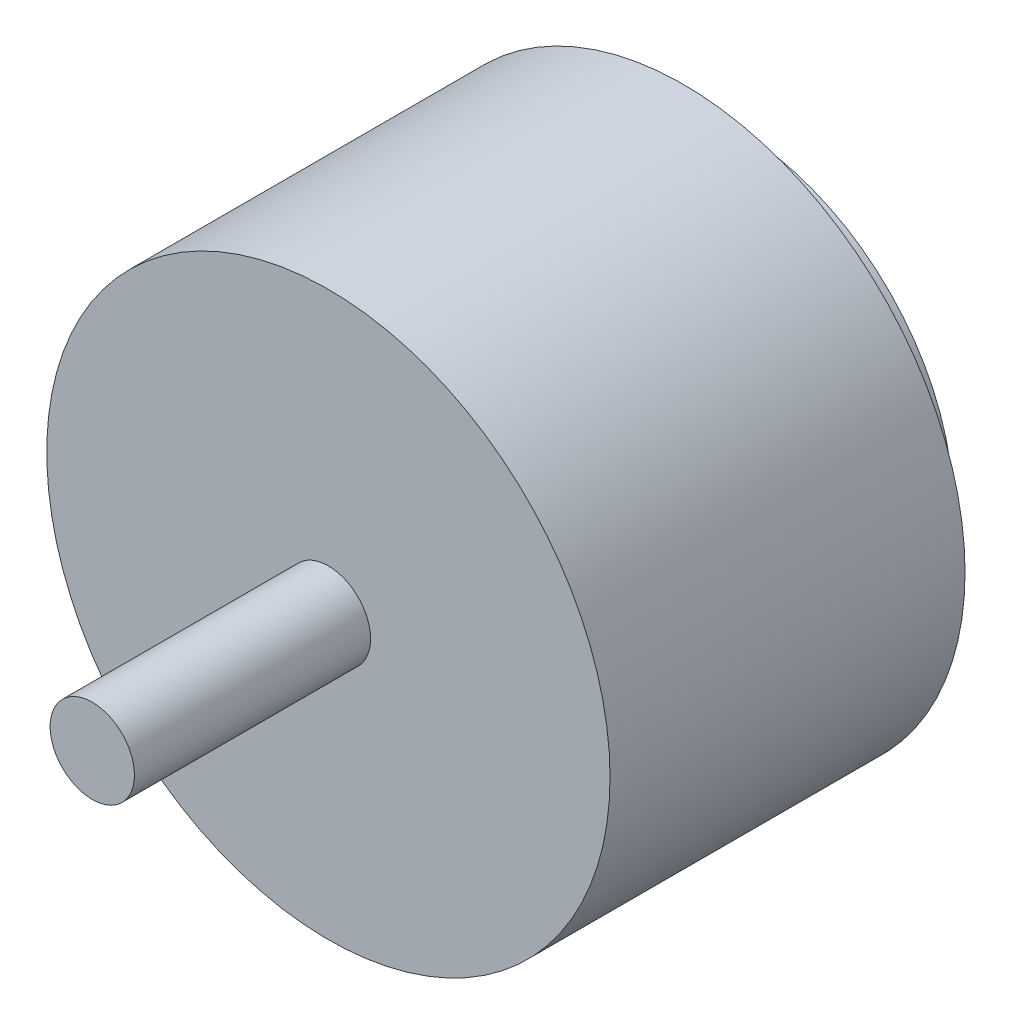
ISO-10303-21;
HEADER;
FILE_DESCRIPTION(('STEP AP214'),'2;1');
FILE_NAME('part.step','',(''),(''),'','','');
FILE_SCHEMA(('AUTOMOTIVE_DESIGN { 1 0 10303 214 1 1 1 1 }'));
ENDSEC;
DATA;
#1=APPLICATION_CONTEXT('core data for automotive mechanical design processes');
#2=APPLICATION_PROTOCOL_DEFINITION('international standard','automotive_design',2000,#1);
#3=PRODUCT_CONTEXT('',#1,'mechanical');
#4=PRODUCT('Part','Part','',(#3));
#5=PRODUCT_RELATED_PRODUCT_CATEGORY('part','',(#4));
#6=PRODUCT_DEFINITION_FORMATION('','',#4);
#7=PRODUCT_DEFINITION_CONTEXT('part definition',#1,'design');
#8=PRODUCT_DEFINITION('design','',#6,#7);
#9=PRODUCT_DEFINITION_SHAPE('','',#8);
#10=(LENGTH_UNIT() NAMED_UNIT(*) SI_UNIT(.MILLI.,.METRE.));
#11=(NAMED_UNIT(*) PLANE_ANGLE_UNIT() SI_UNIT($,.RADIAN.));
#12=(NAMED_UNIT(*) SI_UNIT($,.STERADIAN.) SOLID_ANGLE_UNIT());
#13=UNCERTAINTY_MEASURE_WITH_UNIT(LENGTH_MEASURE(1.E-05),#10,'distance_accuracy_value','');
#14=(GEOMETRIC_REPRESENTATION_CONTEXT(3) GLOBAL_UNCERTAINTY_ASSIGNED_CONTEXT((#13)) GLOBAL_UNIT_ASSIGNED_CONTEXT((#10,
#11,#12)) REPRESENTATION_CONTEXT('',''));
#15=CARTESIAN_POINT('',(0.,0.,0.));
#16=DIRECTION('',(0.,0.,1.));
#17=DIRECTION('',(1.,0.,0.));
#18=AXIS2_PLACEMENT_3D('',#15,#16,#17);
#19=CARTESIAN_POINT('',(0.,0.,0.));
#20=DIRECTION('',(0.,0.,1.));
#21=DIRECTION('',(1.,0.,0.));
#22=AXIS2_PLACEMENT_3D('',#19,#20,#21);
#23=PLANE('',#22);
#24=CARTESIAN_POINT('',(0.,0.,0.));
#25=DIRECTION('',(0.,0.,1.));
#26=DIRECTION('',(1.,0.,0.));
#27=AXIS2_PLACEMENT_3D('',#24,#25,#26);
#28=CIRCLE('',#27,13.);
#29=CARTESIAN_POINT('',(13.,0.,0.));
#30=VERTEX_POINT('',#29);
#31=EDGE_CURVE('E41',#30,#30,#28,.T.);
#32=ORIENTED_EDGE('',*,*,#31,.F.);
#33=EDGE_LOOP('',(#32));
#34=FACE_BOUND('',#33,.T.);
#35=CARTESIAN_POINT('',(-9.5,0.,0.));
#36=DIRECTION('',(0.,0.,1.));
#37=DIRECTION('',(1.,0.,0.));
#38=AXIS2_PLACEMENT_3D('',#35,#36,#37);
#39=CIRCLE('',#38,1.6);
#40=CARTESIAN_POINT('',(-7.9,0.,0.));
#41=VERTEX_POINT('',#40);
#42=EDGE_CURVE('E78',#41,#41,#39,.T.);
#43=ORIENTED_EDGE('',*,*,#42,.T.);
#44=EDGE_LOOP('',(#43));
#45=FACE_BOUND('',#44,.T.);
#46=CARTESIAN_POINT('',(0.,-9.5,0.));
#47=DIRECTION('',(0.,0.,1.));
#48=DIRECTION('',(1.,0.,0.));
#49=AXIS2_PLACEMENT_3D('',#46,#47,#48);
#50=CIRCLE('',#49,1.6);
#51=CARTESIAN_POINT('',(1.6,-9.5,0.));
#52=VERTEX_POINT('',#51);
#53=EDGE_CURVE('E73',#52,#52,#50,.T.);
#54=ORIENTED_EDGE('',*,*,#53,.T.);
#55=EDGE_LOOP('',(#54));
#56=FACE_BOUND('',#55,.T.);
#57=CARTESIAN_POINT('',(9.5,0.,0.));
#58=DIRECTION('',(0.,0.,1.));
#59=DIRECTION('',(1.,0.,0.));
#60=AXIS2_PLACEMENT_3D('',#57,#58,#59);
#61=CIRCLE('',#60,1.6);
#62=CARTESIAN_POINT('',(11.1,0.,0.));
#63=VERTEX_POINT('',#62);
#64=EDGE_CURVE('E66',#63,#63,#61,.T.);
#65=ORIENTED_EDGE('',*,*,#64,.T.);
#66=EDGE_LOOP('',(#65));
#67=FACE_BOUND('',#66,.T.);
#68=CARTESIAN_POINT('',(0.,9.5,0.));
#69=DIRECTION('',(0.,0.,1.));
#70=DIRECTION('',(1.,0.,0.));
#71=AXIS2_PLACEMENT_3D('',#68,#69,#70);
#72=CIRCLE('',#71,1.6);
#73=CARTESIAN_POINT('',(1.6,9.5,0.));
#74=VERTEX_POINT('',#73);
#75=EDGE_CURVE('E63',#74,#74,#72,.T.);
#76=ORIENTED_EDGE('',*,*,#75,.T.);
#77=EDGE_LOOP('',(#76));
#78=FACE_BOUND('',#77,.T.);
#79=ADVANCED_FACE('F37',(#34,#45,#56,#67,#78),#23,.F.);
#80=CARTESIAN_POINT('',(0.,0.,3.));
#81=DIRECTION('',(0.,0.,-1.));
#82=DIRECTION('',(-1.,0.,0.));
#83=AXIS2_PLACEMENT_3D('',#80,#81,#82);
#84=CYLINDRICAL_SURFACE('',#83,13.);
#85=CARTESIAN_POINT('',(0.,0.,3.));
#86=DIRECTION('',(0.,0.,1.));
#87=DIRECTION('',(1.,0.,0.));
#88=AXIS2_PLACEMENT_3D('',#85,#86,#87);
#89=CIRCLE('',#88,13.);
#90=CARTESIAN_POINT('',(13.,0.,3.));
#91=VERTEX_POINT('',#90);
#92=EDGE_CURVE('E45',#91,#91,#89,.T.);
#93=ORIENTED_EDGE('',*,*,#92,.F.);
#94=EDGE_LOOP('',(#93));
#95=FACE_BOUND('',#94,.T.);
#96=ORIENTED_EDGE('',*,*,#31,.T.);
#97=EDGE_LOOP('',(#96));
#98=FACE_BOUND('',#97,.T.);
#99=ADVANCED_FACE('F39',(#95,#98),#84,.T.);
#100=CARTESIAN_POINT('',(-9.5,0.,3.));
#101=DIRECTION('',(0.,0.,-1.));
#102=DIRECTION('',(-1.,0.,0.));
#103=AXIS2_PLACEMENT_3D('',#100,#101,#102);
#104=CYLINDRICAL_SURFACE('',#103,1.6);
#105=CARTESIAN_POINT('',(-9.5,0.,3.));
#106=DIRECTION('',(0.,0.,1.));
#107=DIRECTION('',(1.,0.,0.));
#108=AXIS2_PLACEMENT_3D('',#105,#106,#107);
#109=CIRCLE('',#108,1.6);
#110=CARTESIAN_POINT('',(-7.9,0.,3.));
#111=VERTEX_POINT('',#110);
#112=EDGE_CURVE('E70',#111,#111,#109,.T.);
#113=ORIENTED_EDGE('',*,*,#112,.T.);
#114=EDGE_LOOP('',(#113));
#115=FACE_BOUND('',#114,.T.);
#116=ORIENTED_EDGE('',*,*,#42,.F.);
#117=EDGE_LOOP('',(#116));
#118=FACE_BOUND('',#117,.T.);
#119=ADVANCED_FACE('F118',(#115,#118),#104,.F.);
#120=CARTESIAN_POINT('',(0.,-9.5,3.));
#121=DIRECTION('',(0.,0.,-1.));
#122=DIRECTION('',(-1.,0.,0.));
#123=AXIS2_PLACEMENT_3D('',#120,#121,#122);
#124=CYLINDRICAL_SURFACE('',#123,1.6);
#125=CARTESIAN_POINT('',(0.,-9.5,3.));
#126=DIRECTION('',(0.,0.,1.));
#127=DIRECTION('',(1.,0.,0.));
#128=AXIS2_PLACEMENT_3D('',#125,#126,#127);
#129=CIRCLE('',#128,1.6);
#130=CARTESIAN_POINT('',(1.6,-9.5,3.));
#131=VERTEX_POINT('',#130);
#132=EDGE_CURVE('E62',#131,#131,#129,.T.);
#133=ORIENTED_EDGE('',*,*,#132,.T.);
#134=EDGE_LOOP('',(#133));
#135=FACE_BOUND('',#134,.T.);
#136=ORIENTED_EDGE('',*,*,#53,.F.);
#137=EDGE_LOOP('',(#136));
#138=FACE_BOUND('',#137,.T.);
#139=ADVANCED_FACE('F110',(#135,#138),#124,.F.);
#140=CARTESIAN_POINT('',(9.5,0.,3.));
#141=DIRECTION('',(0.,0.,-1.));
#142=DIRECTION('',(-1.,0.,0.));
#143=AXIS2_PLACEMENT_3D('',#140,#141,#142);
#144=CYLINDRICAL_SURFACE('',#143,1.6);
#145=CARTESIAN_POINT('',(9.5,0.,3.));
#146=DIRECTION('',(0.,0.,1.));
#147=DIRECTION('',(1.,0.,0.));
#148=AXIS2_PLACEMENT_3D('',#145,#146,#147);
#149=CIRCLE('',#148,1.6);
#150=CARTESIAN_POINT('',(11.1,0.,3.));
#151=VERTEX_POINT('',#150);
#152=EDGE_CURVE('E67',#151,#151,#149,.T.);
#153=ORIENTED_EDGE('',*,*,#152,.T.);
#154=EDGE_LOOP('',(#153));
#155=FACE_BOUND('',#154,.T.);
#156=ORIENTED_EDGE('',*,*,#64,.F.);
#157=EDGE_LOOP('',(#156));
#158=FACE_BOUND('',#157,.T.);
#159=ADVANCED_FACE('F99',(#155,#158),#144,.F.);
#160=CARTESIAN_POINT('',(0.,9.5,3.));
#161=DIRECTION('',(0.,0.,-1.));
#162=DIRECTION('',(-1.,0.,0.));
#163=AXIS2_PLACEMENT_3D('',#160,#161,#162);
#164=CYLINDRICAL_SURFACE('',#163,1.6);
#165=CARTESIAN_POINT('',(0.,9.5,3.));
#166=DIRECTION('',(0.,0.,1.));
#167=DIRECTION('',(1.,0.,0.));
#168=AXIS2_PLACEMENT_3D('',#165,#166,#167);
#169=CIRCLE('',#168,1.6);
#170=CARTESIAN_POINT('',(1.6,9.5,3.));
#171=VERTEX_POINT('',#170);
#172=EDGE_CURVE('E56',#171,#171,#169,.T.);
#173=ORIENTED_EDGE('',*,*,#172,.T.);
#174=EDGE_LOOP('',(#173));
#175=FACE_BOUND('',#174,.T.);
#176=ORIENTED_EDGE('',*,*,#75,.F.);
#177=EDGE_LOOP('',(#176));
#178=FACE_BOUND('',#177,.T.);
#179=ADVANCED_FACE('F96',(#175,#178),#164,.F.);
#180=CARTESIAN_POINT('',(0.,0.,3.));
#181=DIRECTION('',(0.,0.,1.));
#182=DIRECTION('',(1.,0.,0.));
#183=AXIS2_PLACEMENT_3D('',#180,#181,#182);
#184=PLANE('',#183);
#185=ORIENTED_EDGE('',*,*,#172,.F.);
#186=EDGE_LOOP('',(#185));
#187=FACE_BOUND('',#186,.T.);
#188=ADVANCED_FACE('F98',(#187),#184,.F.);
#189=ORIENTED_EDGE('',*,*,#132,.F.);
#190=EDGE_LOOP('',(#189));
#191=FACE_BOUND('',#190,.T.);
#192=ADVANCED_FACE('F106',(#191),#184,.F.);
#193=ORIENTED_EDGE('',*,*,#92,.T.);
#194=EDGE_LOOP('',(#193));
#195=FACE_BOUND('',#194,.T.);
#196=CARTESIAN_POINT('',(0.,0.,3.));
#197=DIRECTION('',(0.,0.,1.));
#198=DIRECTION('',(1.,0.,0.));
#199=AXIS2_PLACEMENT_3D('',#196,#197,#198);
#200=CIRCLE('',#199,16.7);
#201=CARTESIAN_POINT('',(16.7,0.,3.));
#202=VERTEX_POINT('',#201);
#203=EDGE_CURVE('E57',#202,#202,#200,.T.);
#204=ORIENTED_EDGE('',*,*,#203,.F.);
#205=EDGE_LOOP('',(#204));
#206=FACE_BOUND('',#205,.T.);
#207=ADVANCED_FACE('F109',(#195,#206),#184,.F.);
#208=CARTESIAN_POINT('',(0.,0.,24.05));
#209=DIRECTION('',(0.,0.,1.));
#210=DIRECTION('',(1.,0.,0.));
#211=AXIS2_PLACEMENT_3D('',#208,#209,#210);
#212=PLANE('',#211);
#213=CARTESIAN_POINT('',(0.,0.,24.05));
#214=DIRECTION('',(0.,0.,1.));
#215=DIRECTION('',(1.,0.,0.));
#216=AXIS2_PLACEMENT_3D('',#213,#214,#215);
#217=CIRCLE('',#216,2.5);
#218=CARTESIAN_POINT('',(2.5,0.,24.05));
#219=VERTEX_POINT('',#218);
#220=EDGE_CURVE('E10',#219,#219,#217,.T.);
#221=ORIENTED_EDGE('',*,*,#220,.F.);
#222=EDGE_LOOP('',(#221));
#223=FACE_BOUND('',#222,.T.);
#224=CARTESIAN_POINT('',(0.,0.,24.05));
#225=DIRECTION('',(0.,0.,1.));
#226=DIRECTION('',(1.,0.,0.));
#227=AXIS2_PLACEMENT_3D('',#224,#225,#226);
#228=CIRCLE('',#227,16.7);
#229=CARTESIAN_POINT('',(16.7,0.,24.05));
#230=VERTEX_POINT('',#229);
#231=EDGE_CURVE('E53',#230,#230,#228,.T.);
#232=ORIENTED_EDGE('',*,*,#231,.T.);
#233=EDGE_LOOP('',(#232));
#234=FACE_BOUND('',#233,.T.);
#235=ADVANCED_FACE('F138',(#223,#234),#212,.T.);
#236=CARTESIAN_POINT('',(0.,0.,24.05));
#237=DIRECTION('',(0.,0.,-1.));
#238=DIRECTION('',(-1.,0.,0.));
#239=AXIS2_PLACEMENT_3D('',#236,#237,#238);
#240=CYLINDRICAL_SURFACE('',#239,16.7);
#241=ORIENTED_EDGE('',*,*,#231,.F.);
#242=EDGE_LOOP('',(#241));
#243=FACE_BOUND('',#242,.T.);
#244=ORIENTED_EDGE('',*,*,#203,.T.);
#245=EDGE_LOOP('',(#244));
#246=FACE_BOUND('',#245,.T.);
#247=ADVANCED_FACE('F114',(#243,#246),#240,.T.);
#248=ORIENTED_EDGE('',*,*,#112,.F.);
#249=EDGE_LOOP('',(#248));
#250=FACE_BOUND('',#249,.T.);
#251=ADVANCED_FACE('F129',(#250),#184,.F.);
#252=ORIENTED_EDGE('',*,*,#152,.F.);
#253=EDGE_LOOP('',(#252));
#254=FACE_BOUND('',#253,.T.);
#255=ADVANCED_FACE('F131',(#254),#184,.F.);
#256=CARTESIAN_POINT('',(0.,0.,38.05));
#257=DIRECTION('',(0.,0.,-1.));
#258=DIRECTION('',(-1.,0.,0.));
#259=AXIS2_PLACEMENT_3D('',#256,#257,#258);
#260=CYLINDRICAL_SURFACE('',#259,2.5);
#261=CARTESIAN_POINT('',(0.,0.,38.05));
#262=DIRECTION('',(0.,0.,1.));
#263=DIRECTION('',(1.,0.,0.));
#264=AXIS2_PLACEMENT_3D('',#261,#262,#263);
#265=CIRCLE('',#264,2.5);
#266=CARTESIAN_POINT('',(2.5,0.,38.05));
#267=VERTEX_POINT('',#266);
#268=EDGE_CURVE('E52',#267,#267,#265,.T.);
#269=ORIENTED_EDGE('',*,*,#268,.F.);
#270=EDGE_LOOP('',(#269));
#271=FACE_BOUND('',#270,.T.);
#272=ORIENTED_EDGE('',*,*,#220,.T.);
#273=EDGE_LOOP('',(#272));
#274=FACE_BOUND('',#273,.T.);
#275=ADVANCED_FACE('F136',(#271,#274),#260,.T.);
#276=CARTESIAN_POINT('',(0.,0.,38.05));
#277=DIRECTION('',(0.,0.,1.));
#278=DIRECTION('',(1.,0.,0.));
#279=AXIS2_PLACEMENT_3D('',#276,#277,#278);
#280=PLANE('',#279);
#281=ORIENTED_EDGE('',*,*,#268,.T.);
#282=EDGE_LOOP('',(#281));
#283=FACE_BOUND('',#282,.T.);
#284=ADVANCED_FACE('F163',(#283),#280,.T.);
#285=CLOSED_SHELL('',(#79,#99,#119,#139,#159,#179,#188,#192,#207,#235,#247,#251,#255,#275,#284));
#286=MANIFOLD_SOLID_BREP('B2',#285);
#287=ADVANCED_BREP_SHAPE_REPRESENTATION('',(#18,#286),#14);
#288=SHAPE_DEFINITION_REPRESENTATION(#9,#287);
ENDSEC;
END-ISO-10303-21;
